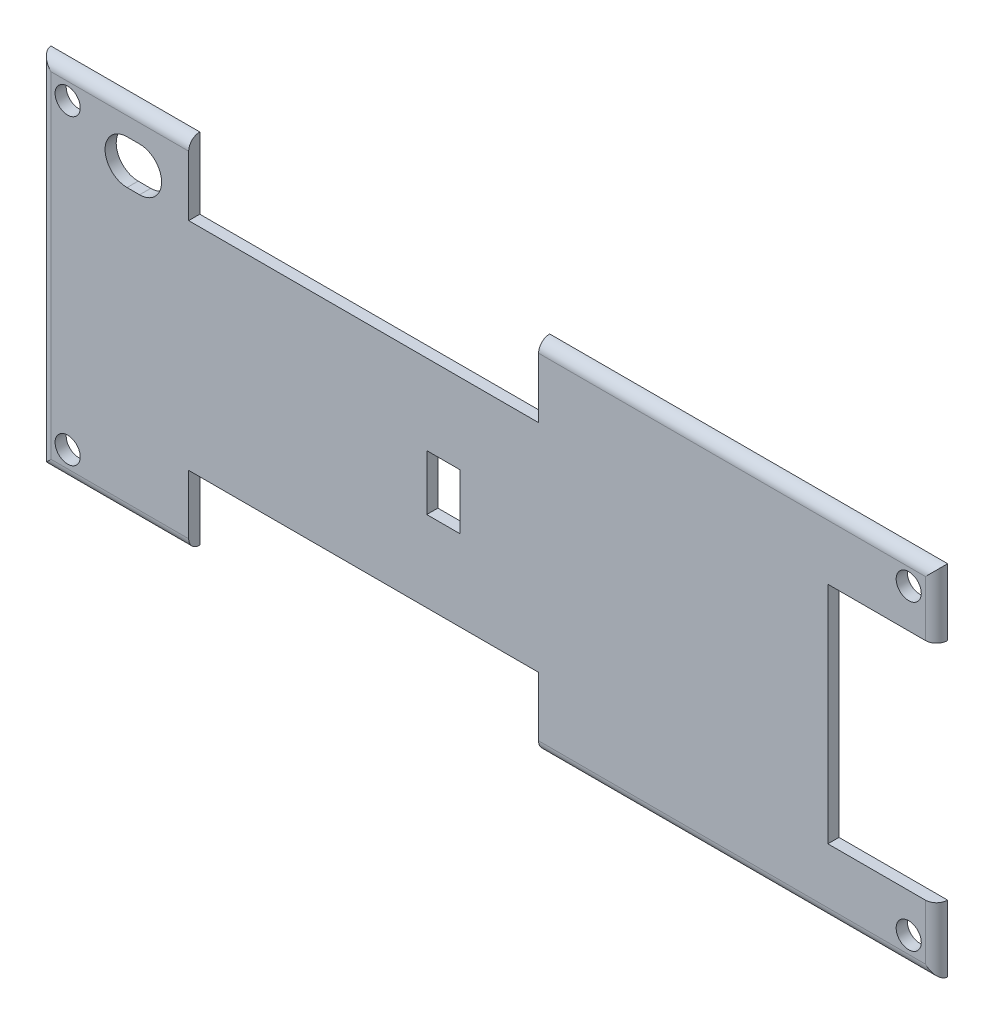
ISO-10303-21;
HEADER;
FILE_DESCRIPTION(('STEP AP214'),'2;1');
FILE_NAME('part.step','',(''),(''),'','','');
FILE_SCHEMA(('AUTOMOTIVE_DESIGN { 1 0 10303 214 1 1 1 1 }'));
ENDSEC;
DATA;
#1=APPLICATION_CONTEXT('core data for automotive mechanical design processes');
#2=APPLICATION_PROTOCOL_DEFINITION('international standard','automotive_design',2000,#1);
#3=PRODUCT_CONTEXT('',#1,'mechanical');
#4=PRODUCT('Part','Part','',(#3));
#5=PRODUCT_RELATED_PRODUCT_CATEGORY('part','',(#4));
#6=PRODUCT_DEFINITION_FORMATION('','',#4);
#7=PRODUCT_DEFINITION_CONTEXT('part definition',#1,'design');
#8=PRODUCT_DEFINITION('design','',#6,#7);
#9=PRODUCT_DEFINITION_SHAPE('','',#8);
#10=(LENGTH_UNIT() NAMED_UNIT(*) SI_UNIT(.MILLI.,.METRE.));
#11=(NAMED_UNIT(*) PLANE_ANGLE_UNIT() SI_UNIT($,.RADIAN.));
#12=(NAMED_UNIT(*) SI_UNIT($,.STERADIAN.) SOLID_ANGLE_UNIT());
#13=UNCERTAINTY_MEASURE_WITH_UNIT(LENGTH_MEASURE(1.E-05),#10,'distance_accuracy_value','');
#14=(GEOMETRIC_REPRESENTATION_CONTEXT(3) GLOBAL_UNCERTAINTY_ASSIGNED_CONTEXT((#13)) GLOBAL_UNIT_ASSIGNED_CONTEXT((#10,
#11,#12)) REPRESENTATION_CONTEXT('',''));
#15=CARTESIAN_POINT('',(0.,0.,0.));
#16=DIRECTION('',(0.,0.,1.));
#17=DIRECTION('',(1.,0.,0.));
#18=AXIS2_PLACEMENT_3D('',#15,#16,#17);
#19=CARTESIAN_POINT('',(0.,0.,1.));
#20=DIRECTION('',(0.,0.,1.));
#21=DIRECTION('',(1.,0.,0.));
#22=AXIS2_PLACEMENT_3D('',#19,#20,#21);
#23=PLANE('',#22);
#24=CARTESIAN_POINT('',(38.0906669286224,13.6,1.));
#25=DIRECTION('',(0.,0.,1.));
#26=DIRECTION('',(1.,0.,0.));
#27=AXIS2_PLACEMENT_3D('',#24,#25,#26);
#28=CIRCLE('',#27,1.1303);
#29=CARTESIAN_POINT('',(39.2209669286224,13.6,1.));
#30=VERTEX_POINT('',#29);
#31=EDGE_CURVE('E725',#30,#30,#28,.T.);
#32=ORIENTED_EDGE('',*,*,#31,.F.);
#33=EDGE_LOOP('',(#32));
#34=FACE_BOUND('',#33,.T.);
#35=CARTESIAN_POINT('',(-37.5321887929775,-13.58,1.));
#36=DIRECTION('',(0.,0.,1.));
#37=DIRECTION('',(1.,0.,0.));
#38=AXIS2_PLACEMENT_3D('',#35,#36,#37);
#39=CIRCLE('',#38,1.1303);
#40=CARTESIAN_POINT('',(-36.4018887929775,-13.58,1.));
#41=VERTEX_POINT('',#40);
#42=EDGE_CURVE('E233',#41,#41,#39,.T.);
#43=ORIENTED_EDGE('',*,*,#42,.F.);
#44=EDGE_LOOP('',(#43));
#45=FACE_BOUND('',#44,.T.);
#46=DIRECTION('',(1.,0.,0.));
#47=VECTOR('',#46,1.);
#48=CARTESIAN_POINT('',(30.8221984970327,10.1158248312757,1.));
#49=LINE('',#48,#47);
#50=CARTESIAN_POINT('',(30.8221984970327,10.1158248312757,1.));
#51=VERTEX_POINT('',#50);
#52=CARTESIAN_POINT('',(39.5906669286224,10.1158248312757,1.));
#53=VERTEX_POINT('',#52);
#54=EDGE_CURVE('E289',#51,#53,#49,.T.);
#55=ORIENTED_EDGE('',*,*,#54,.T.);
#56=DIRECTION('',(0.,1.,0.));
#57=VECTOR('',#56,1.);
#58=CARTESIAN_POINT('',(39.5906669286224,16.1,1.));
#59=LINE('',#58,#57);
#60=CARTESIAN_POINT('',(39.5906669286224,15.1,1.));
#61=VERTEX_POINT('',#60);
#62=EDGE_CURVE('E363',#53,#61,#59,.T.);
#63=ORIENTED_EDGE('',*,*,#62,.T.);
#64=DIRECTION('',(-1.,0.,0.));
#65=VECTOR('',#64,1.);
#66=CARTESIAN_POINT('',(4.81,15.1,1.));
#67=LINE('',#66,#65);
#68=CARTESIAN_POINT('',(4.81,15.1,1.));
#69=VERTEX_POINT('',#68);
#70=EDGE_CURVE('E361',#61,#69,#67,.T.);
#71=ORIENTED_EDGE('',*,*,#70,.T.);
#72=DIRECTION('',(0.,-1.,0.));
#73=VECTOR('',#72,1.);
#74=CARTESIAN_POINT('',(4.81,16.1,1.));
#75=LINE('',#74,#73);
#76=CARTESIAN_POINT('',(4.81,9.69393661700284,1.));
#77=VERTEX_POINT('',#76);
#78=EDGE_CURVE('E292',#69,#77,#75,.T.);
#79=ORIENTED_EDGE('',*,*,#78,.T.);
#80=DIRECTION('',(-1.,0.,0.));
#81=VECTOR('',#80,1.);
#82=CARTESIAN_POINT('',(4.81,9.69393661700284,1.));
#83=LINE('',#82,#81);
#84=CARTESIAN_POINT('',(-26.65,9.69393661700284,1.));
#85=VERTEX_POINT('',#84);
#86=EDGE_CURVE('E294',#77,#85,#83,.T.);
#87=ORIENTED_EDGE('',*,*,#86,.T.);
#88=DIRECTION('',(0.,1.,0.));
#89=VECTOR('',#88,1.);
#90=CARTESIAN_POINT('',(-26.65,9.69393661700284,1.));
#91=LINE('',#90,#89);
#92=CARTESIAN_POINT('',(-26.65,15.1,1.));
#93=VERTEX_POINT('',#92);
#94=EDGE_CURVE('E275',#85,#93,#91,.T.);
#95=ORIENTED_EDGE('',*,*,#94,.T.);
#96=DIRECTION('',(-1.,0.,0.));
#97=VECTOR('',#96,1.);
#98=CARTESIAN_POINT('',(-40.0321887929775,15.1,1.));
#99=LINE('',#98,#97);
#100=CARTESIAN_POINT('',(-39.0321887929775,15.1,1.));
#101=VERTEX_POINT('',#100);
#102=EDGE_CURVE('E351',#93,#101,#99,.T.);
#103=ORIENTED_EDGE('',*,*,#102,.T.);
#104=DIRECTION('',(0.,-1.,0.));
#105=VECTOR('',#104,1.);
#106=CARTESIAN_POINT('',(-39.0321887929775,-16.08,1.));
#107=LINE('',#106,#105);
#108=CARTESIAN_POINT('',(-39.0321887929775,-15.08,1.));
#109=VERTEX_POINT('',#108);
#110=EDGE_CURVE('E353',#101,#109,#107,.T.);
#111=ORIENTED_EDGE('',*,*,#110,.T.);
#112=DIRECTION('',(1.,0.,0.));
#113=VECTOR('',#112,1.);
#114=CARTESIAN_POINT('',(-26.65,-15.08,1.));
#115=LINE('',#114,#113);
#116=CARTESIAN_POINT('',(-26.65,-15.08,1.));
#117=VERTEX_POINT('',#116);
#118=EDGE_CURVE('E355',#109,#117,#115,.T.);
#119=ORIENTED_EDGE('',*,*,#118,.T.);
#120=DIRECTION('',(0.,1.,0.));
#121=VECTOR('',#120,1.);
#122=CARTESIAN_POINT('',(-26.65,-16.08,1.));
#123=LINE('',#122,#121);
#124=CARTESIAN_POINT('',(-26.65,-9.75218635475669,1.));
#125=VERTEX_POINT('',#124);
#126=EDGE_CURVE('E278',#117,#125,#123,.T.);
#127=ORIENTED_EDGE('',*,*,#126,.T.);
#128=DIRECTION('',(1.,0.,0.));
#129=VECTOR('',#128,1.);
#130=CARTESIAN_POINT('',(-26.65,-9.75218635475669,1.));
#131=LINE('',#130,#129);
#132=CARTESIAN_POINT('',(4.81,-9.75218635475669,1.));
#133=VERTEX_POINT('',#132);
#134=EDGE_CURVE('E281',#125,#133,#131,.T.);
#135=ORIENTED_EDGE('',*,*,#134,.T.);
#136=DIRECTION('',(0.,-1.,0.));
#137=VECTOR('',#136,1.);
#138=CARTESIAN_POINT('',(4.81,-9.75218635475669,1.));
#139=LINE('',#138,#137);
#140=CARTESIAN_POINT('',(4.81,-15.08,1.));
#141=VERTEX_POINT('',#140);
#142=EDGE_CURVE('E283',#133,#141,#139,.T.);
#143=ORIENTED_EDGE('',*,*,#142,.T.);
#144=DIRECTION('',(1.,0.,0.));
#145=VECTOR('',#144,1.);
#146=CARTESIAN_POINT('',(40.5906669286224,-15.08,1.));
#147=LINE('',#146,#145);
#148=CARTESIAN_POINT('',(39.5906669286224,-15.08,1.));
#149=VERTEX_POINT('',#148);
#150=EDGE_CURVE('E58',#141,#149,#147,.T.);
#151=ORIENTED_EDGE('',*,*,#150,.T.);
#152=DIRECTION('',(0.,1.,0.));
#153=VECTOR('',#152,1.);
#154=CARTESIAN_POINT('',(39.5906669286224,-10.0958248312755,1.));
#155=LINE('',#154,#153);
#156=CARTESIAN_POINT('',(39.5906669286224,-10.0958248312755,1.));
#157=VERTEX_POINT('',#156);
#158=EDGE_CURVE('E359',#149,#157,#155,.T.);
#159=ORIENTED_EDGE('',*,*,#158,.T.);
#160=DIRECTION('',(-1.,0.,0.));
#161=VECTOR('',#160,1.);
#162=CARTESIAN_POINT('',(40.5906669286224,-10.0958248312755,1.));
#163=LINE('',#162,#161);
#164=CARTESIAN_POINT('',(30.8221984970327,-10.0958248312755,1.));
#165=VERTEX_POINT('',#164);
#166=EDGE_CURVE('E285',#157,#165,#163,.T.);
#167=ORIENTED_EDGE('',*,*,#166,.T.);
#168=DIRECTION('',(0.,1.,0.));
#169=VECTOR('',#168,1.);
#170=CARTESIAN_POINT('',(30.8221984970327,-10.0958248312755,1.));
#171=LINE('',#170,#169);
#172=EDGE_CURVE('E287',#165,#51,#171,.T.);
#173=ORIENTED_EDGE('',*,*,#172,.T.);
#174=EDGE_LOOP('',(#55,#63,#71,#79,#87,#95,#103,#111,#119,#127,#135,#143,#151,#159,#167,#173));
#175=FACE_BOUND('',#174,.T.);
#176=DIRECTION('',(-1.,0.,0.));
#177=VECTOR('',#176,1.);
#178=CARTESIAN_POINT('',(-5.24392192876722,2.48999999999999,1.));
#179=LINE('',#178,#177);
#180=CARTESIAN_POINT('',(-2.26000000000001,2.48999999999999,1.));
#181=VERTEX_POINT('',#180);
#182=CARTESIAN_POINT('',(-5.24392192876722,2.48999999999999,1.));
#183=VERTEX_POINT('',#182);
#184=EDGE_CURVE('E246',#181,#183,#179,.T.);
#185=ORIENTED_EDGE('',*,*,#184,.F.);
#186=DIRECTION('',(0.,1.,0.));
#187=VECTOR('',#186,1.);
#188=CARTESIAN_POINT('',(-2.26000000000001,2.48999999999999,1.));
#189=LINE('',#188,#187);
#190=CARTESIAN_POINT('',(-2.26000000000001,-2.48999999999999,1.));
#191=VERTEX_POINT('',#190);
#192=EDGE_CURVE('E244',#191,#181,#189,.T.);
#193=ORIENTED_EDGE('',*,*,#192,.F.);
#194=DIRECTION('',(1.,0.,0.));
#195=VECTOR('',#194,1.);
#196=CARTESIAN_POINT('',(-5.24392192876722,-2.48999999999999,1.));
#197=LINE('',#196,#195);
#198=CARTESIAN_POINT('',(-5.24392192876722,-2.48999999999999,1.));
#199=VERTEX_POINT('',#198);
#200=EDGE_CURVE('E252',#199,#191,#197,.T.);
#201=ORIENTED_EDGE('',*,*,#200,.F.);
#202=DIRECTION('',(0.,-1.,0.));
#203=VECTOR('',#202,1.);
#204=CARTESIAN_POINT('',(-5.24392192876722,2.48999999999999,1.));
#205=LINE('',#204,#203);
#206=EDGE_CURVE('E249',#183,#199,#205,.T.);
#207=ORIENTED_EDGE('',*,*,#206,.F.);
#208=EDGE_LOOP('',(#185,#193,#201,#207));
#209=FACE_BOUND('',#208,.T.);
#210=DIRECTION('',(1.,0.,0.));
#211=VECTOR('',#210,1.);
#212=CARTESIAN_POINT('',(-32.1905916273917,9.50086591659359,1.));
#213=LINE('',#212,#211);
#214=CARTESIAN_POINT('',(-32.1905916273917,9.50086591659359,1.));
#215=VERTEX_POINT('',#214);
#216=CARTESIAN_POINT('',(-31.0617891364603,9.50086591659359,1.));
#217=VERTEX_POINT('',#216);
#218=EDGE_CURVE('E210',#215,#217,#213,.T.);
#219=ORIENTED_EDGE('',*,*,#218,.F.);
#220=CARTESIAN_POINT('',(-32.1905916273917,11.4763044446907,1.));
#221=DIRECTION('',(0.,0.,1.));
#222=DIRECTION('',(1.,0.,0.));
#223=AXIS2_PLACEMENT_3D('',#220,#221,#222);
#224=CIRCLE('',#223,1.97543852809706);
#225=CARTESIAN_POINT('',(-32.1905916273917,13.4517429727877,1.));
#226=VERTEX_POINT('',#225);
#227=EDGE_CURVE('E200',#226,#215,#224,.T.);
#228=ORIENTED_EDGE('',*,*,#227,.F.);
#229=DIRECTION('',(-1.,0.,0.));
#230=VECTOR('',#229,1.);
#231=CARTESIAN_POINT('',(-32.1905916273917,13.4517429727877,1.));
#232=LINE('',#231,#230);
#233=CARTESIAN_POINT('',(-31.0617891364603,13.4517429727877,1.));
#234=VERTEX_POINT('',#233);
#235=EDGE_CURVE('E226',#234,#226,#232,.T.);
#236=ORIENTED_EDGE('',*,*,#235,.F.);
#237=CARTESIAN_POINT('',(-31.0617891364603,11.4763044446907,1.));
#238=DIRECTION('',(0.,0.,1.));
#239=DIRECTION('',(1.,0.,0.));
#240=AXIS2_PLACEMENT_3D('',#237,#238,#239);
#241=CIRCLE('',#240,1.97543852809706);
#242=EDGE_CURVE('E224',#217,#234,#241,.T.);
#243=ORIENTED_EDGE('',*,*,#242,.F.);
#244=EDGE_LOOP('',(#219,#228,#236,#243));
#245=FACE_BOUND('',#244,.T.);
#246=CARTESIAN_POINT('',(-37.5321887929775,13.6,1.));
#247=DIRECTION('',(0.,0.,1.));
#248=DIRECTION('',(1.,0.,0.));
#249=AXIS2_PLACEMENT_3D('',#246,#247,#248);
#250=CIRCLE('',#249,1.1303);
#251=CARTESIAN_POINT('',(-36.4018887929775,13.6,1.));
#252=VERTEX_POINT('',#251);
#253=EDGE_CURVE('E731',#252,#252,#250,.T.);
#254=ORIENTED_EDGE('',*,*,#253,.F.);
#255=EDGE_LOOP('',(#254));
#256=FACE_BOUND('',#255,.T.);
#257=CARTESIAN_POINT('',(38.0906669286224,-13.58,1.));
#258=DIRECTION('',(0.,0.,1.));
#259=DIRECTION('',(1.,0.,0.));
#260=AXIS2_PLACEMENT_3D('',#257,#258,#259);
#261=CIRCLE('',#260,1.1303);
#262=CARTESIAN_POINT('',(39.2209669286224,-13.58,1.));
#263=VERTEX_POINT('',#262);
#264=EDGE_CURVE('E717',#263,#263,#261,.T.);
#265=ORIENTED_EDGE('',*,*,#264,.F.);
#266=EDGE_LOOP('',(#265));
#267=FACE_BOUND('',#266,.T.);
#268=ADVANCED_FACE('F33',(#34,#45,#175,#209,#245,#256,#267),#23,.T.);
#269=CARTESIAN_POINT('',(0.,0.,0.));
#270=DIRECTION('',(0.,0.,1.));
#271=DIRECTION('',(1.,0.,0.));
#272=AXIS2_PLACEMENT_3D('',#269,#270,#271);
#273=PLANE('',#272);
#274=DIRECTION('',(0.,1.,0.));
#275=VECTOR('',#274,1.);
#276=CARTESIAN_POINT('',(-2.26000000000001,2.48999999999999,0.));
#277=LINE('',#276,#275);
#278=CARTESIAN_POINT('',(-2.26000000000001,-2.48999999999999,0.));
#279=VERTEX_POINT('',#278);
#280=CARTESIAN_POINT('',(-2.26000000000001,2.48999999999999,0.));
#281=VERTEX_POINT('',#280);
#282=EDGE_CURVE('E218',#279,#281,#277,.T.);
#283=ORIENTED_EDGE('',*,*,#282,.T.);
#284=DIRECTION('',(-1.,0.,0.));
#285=VECTOR('',#284,1.);
#286=CARTESIAN_POINT('',(-5.24392192876722,2.48999999999999,0.));
#287=LINE('',#286,#285);
#288=CARTESIAN_POINT('',(-5.24392192876722,2.48999999999999,0.));
#289=VERTEX_POINT('',#288);
#290=EDGE_CURVE('E257',#281,#289,#287,.T.);
#291=ORIENTED_EDGE('',*,*,#290,.T.);
#292=DIRECTION('',(0.,-1.,0.));
#293=VECTOR('',#292,1.);
#294=CARTESIAN_POINT('',(-5.24392192876722,2.48999999999999,0.));
#295=LINE('',#294,#293);
#296=CARTESIAN_POINT('',(-5.24392192876722,-2.48999999999999,0.));
#297=VERTEX_POINT('',#296);
#298=EDGE_CURVE('E260',#289,#297,#295,.T.);
#299=ORIENTED_EDGE('',*,*,#298,.T.);
#300=DIRECTION('',(1.,0.,0.));
#301=VECTOR('',#300,1.);
#302=CARTESIAN_POINT('',(-5.24392192876722,-2.48999999999999,0.));
#303=LINE('',#302,#301);
#304=EDGE_CURVE('E247',#297,#279,#303,.T.);
#305=ORIENTED_EDGE('',*,*,#304,.T.);
#306=EDGE_LOOP('',(#283,#291,#299,#305));
#307=FACE_BOUND('',#306,.T.);
#308=DIRECTION('',(0.,1.,0.));
#309=VECTOR('',#308,1.);
#310=CARTESIAN_POINT('',(-26.65,9.69393661700284,0.));
#311=LINE('',#310,#309);
#312=CARTESIAN_POINT('',(-26.65,9.69393661700284,0.));
#313=VERTEX_POINT('',#312);
#314=CARTESIAN_POINT('',(-26.65,16.1,0.));
#315=VERTEX_POINT('',#314);
#316=EDGE_CURVE('E274',#313,#315,#311,.T.);
#317=ORIENTED_EDGE('',*,*,#316,.F.);
#318=DIRECTION('',(-1.,0.,0.));
#319=VECTOR('',#318,1.);
#320=CARTESIAN_POINT('',(4.81,9.69393661700284,0.));
#321=LINE('',#320,#319);
#322=CARTESIAN_POINT('',(4.81,9.69393661700284,0.));
#323=VERTEX_POINT('',#322);
#324=EDGE_CURVE('E279',#323,#313,#321,.T.);
#325=ORIENTED_EDGE('',*,*,#324,.F.);
#326=DIRECTION('',(0.,-1.,0.));
#327=VECTOR('',#326,1.);
#328=CARTESIAN_POINT('',(4.81,16.1,0.));
#329=LINE('',#328,#327);
#330=CARTESIAN_POINT('',(4.81,16.1,0.));
#331=VERTEX_POINT('',#330);
#332=EDGE_CURVE('E331',#331,#323,#329,.T.);
#333=ORIENTED_EDGE('',*,*,#332,.F.);
#334=DIRECTION('',(-1.,0.,0.));
#335=VECTOR('',#334,1.);
#336=CARTESIAN_POINT('',(40.5906669286224,16.1,0.));
#337=LINE('',#336,#335);
#338=CARTESIAN_POINT('',(40.5906669286224,16.1,0.));
#339=VERTEX_POINT('',#338);
#340=EDGE_CURVE('E328',#339,#331,#337,.T.);
#341=ORIENTED_EDGE('',*,*,#340,.F.);
#342=DIRECTION('',(0.,1.,0.));
#343=VECTOR('',#342,1.);
#344=CARTESIAN_POINT('',(40.5906669286224,10.1158248312757,0.));
#345=LINE('',#344,#343);
#346=CARTESIAN_POINT('',(40.5906669286224,10.1158248312757,0.));
#347=VERTEX_POINT('',#346);
#348=EDGE_CURVE('E326',#347,#339,#345,.T.);
#349=ORIENTED_EDGE('',*,*,#348,.F.);
#350=DIRECTION('',(1.,0.,0.));
#351=VECTOR('',#350,1.);
#352=CARTESIAN_POINT('',(30.8221984970327,10.1158248312757,0.));
#353=LINE('',#352,#351);
#354=CARTESIAN_POINT('',(30.8221984970327,10.1158248312757,0.));
#355=VERTEX_POINT('',#354);
#356=EDGE_CURVE('E324',#355,#347,#353,.T.);
#357=ORIENTED_EDGE('',*,*,#356,.F.);
#358=DIRECTION('',(0.,1.,0.));
#359=VECTOR('',#358,1.);
#360=CARTESIAN_POINT('',(30.8221984970327,-10.0958248312755,0.));
#361=LINE('',#360,#359);
#362=CARTESIAN_POINT('',(30.8221984970327,-10.0958248312755,0.));
#363=VERTEX_POINT('',#362);
#364=EDGE_CURVE('E322',#363,#355,#361,.T.);
#365=ORIENTED_EDGE('',*,*,#364,.F.);
#366=DIRECTION('',(-1.,0.,0.));
#367=VECTOR('',#366,1.);
#368=CARTESIAN_POINT('',(40.5906669286224,-10.0958248312755,0.));
#369=LINE('',#368,#367);
#370=CARTESIAN_POINT('',(40.5906669286224,-10.0958248312755,0.));
#371=VERTEX_POINT('',#370);
#372=EDGE_CURVE('E320',#371,#363,#369,.T.);
#373=ORIENTED_EDGE('',*,*,#372,.F.);
#374=DIRECTION('',(0.,1.,0.));
#375=VECTOR('',#374,1.);
#376=CARTESIAN_POINT('',(40.5906669286224,-16.08,0.));
#377=LINE('',#376,#375);
#378=CARTESIAN_POINT('',(40.5906669286224,-16.08,0.));
#379=VERTEX_POINT('',#378);
#380=EDGE_CURVE('E317',#379,#371,#377,.T.);
#381=ORIENTED_EDGE('',*,*,#380,.F.);
#382=DIRECTION('',(1.,0.,0.));
#383=VECTOR('',#382,1.);
#384=CARTESIAN_POINT('',(4.81,-16.08,0.));
#385=LINE('',#384,#383);
#386=CARTESIAN_POINT('',(4.81,-16.08,0.));
#387=VERTEX_POINT('',#386);
#388=EDGE_CURVE('E314',#387,#379,#385,.T.);
#389=ORIENTED_EDGE('',*,*,#388,.F.);
#390=DIRECTION('',(0.,-1.,0.));
#391=VECTOR('',#390,1.);
#392=CARTESIAN_POINT('',(4.81,-9.75218635475669,0.));
#393=LINE('',#392,#391);
#394=CARTESIAN_POINT('',(4.81,-9.75218635475669,0.));
#395=VERTEX_POINT('',#394);
#396=EDGE_CURVE('E312',#395,#387,#393,.T.);
#397=ORIENTED_EDGE('',*,*,#396,.F.);
#398=DIRECTION('',(1.,0.,0.));
#399=VECTOR('',#398,1.);
#400=CARTESIAN_POINT('',(-26.65,-9.75218635475669,0.));
#401=LINE('',#400,#399);
#402=CARTESIAN_POINT('',(-26.65,-9.75218635475669,0.));
#403=VERTEX_POINT('',#402);
#404=EDGE_CURVE('E310',#403,#395,#401,.T.);
#405=ORIENTED_EDGE('',*,*,#404,.F.);
#406=DIRECTION('',(0.,1.,0.));
#407=VECTOR('',#406,1.);
#408=CARTESIAN_POINT('',(-26.65,-16.08,0.));
#409=LINE('',#408,#407);
#410=CARTESIAN_POINT('',(-26.65,-16.08,0.));
#411=VERTEX_POINT('',#410);
#412=EDGE_CURVE('E308',#411,#403,#409,.T.);
#413=ORIENTED_EDGE('',*,*,#412,.F.);
#414=DIRECTION('',(1.,0.,0.));
#415=VECTOR('',#414,1.);
#416=CARTESIAN_POINT('',(-40.0321887929775,-16.08,0.));
#417=LINE('',#416,#415);
#418=CARTESIAN_POINT('',(-40.0321887929775,-16.08,0.));
#419=VERTEX_POINT('',#418);
#420=EDGE_CURVE('E305',#419,#411,#417,.T.);
#421=ORIENTED_EDGE('',*,*,#420,.F.);
#422=DIRECTION('',(0.,-1.,0.));
#423=VECTOR('',#422,1.);
#424=CARTESIAN_POINT('',(-40.0321887929775,16.1,0.));
#425=LINE('',#424,#423);
#426=CARTESIAN_POINT('',(-40.0321887929775,16.1,0.));
#427=VERTEX_POINT('',#426);
#428=EDGE_CURVE('E302',#427,#419,#425,.T.);
#429=ORIENTED_EDGE('',*,*,#428,.F.);
#430=DIRECTION('',(-1.,0.,0.));
#431=VECTOR('',#430,1.);
#432=CARTESIAN_POINT('',(-26.65,16.1,0.));
#433=LINE('',#432,#431);
#434=EDGE_CURVE('E299',#315,#427,#433,.T.);
#435=ORIENTED_EDGE('',*,*,#434,.F.);
#436=EDGE_LOOP('',(#317,#325,#333,#341,#349,#357,#365,#373,#381,#389,#397,#405,#413,#421,#429,#435));
#437=FACE_BOUND('',#436,.T.);
#438=CARTESIAN_POINT('',(-32.1905916273917,11.4763044446907,0.));
#439=DIRECTION('',(0.,0.,1.));
#440=DIRECTION('',(1.,0.,0.));
#441=AXIS2_PLACEMENT_3D('',#438,#439,#440);
#442=CIRCLE('',#441,1.97543852809706);
#443=CARTESIAN_POINT('',(-32.1905916273917,13.4517429727877,0.));
#444=VERTEX_POINT('',#443);
#445=CARTESIAN_POINT('',(-32.1905916273917,9.50086591659359,0.));
#446=VERTEX_POINT('',#445);
#447=EDGE_CURVE('E231',#444,#446,#442,.T.);
#448=ORIENTED_EDGE('',*,*,#447,.T.);
#449=DIRECTION('',(1.,0.,0.));
#450=VECTOR('',#449,1.);
#451=CARTESIAN_POINT('',(-32.1905916273917,9.50086591659359,0.));
#452=LINE('',#451,#450);
#453=CARTESIAN_POINT('',(-31.0617891364603,9.50086591659359,0.));
#454=VERTEX_POINT('',#453);
#455=EDGE_CURVE('E217',#446,#454,#452,.T.);
#456=ORIENTED_EDGE('',*,*,#455,.T.);
#457=CARTESIAN_POINT('',(-31.0617891364603,11.4763044446907,0.));
#458=DIRECTION('',(0.,0.,1.));
#459=DIRECTION('',(1.,0.,0.));
#460=AXIS2_PLACEMENT_3D('',#457,#458,#459);
#461=CIRCLE('',#460,1.97543852809706);
#462=CARTESIAN_POINT('',(-31.0617891364603,13.4517429727877,0.));
#463=VERTEX_POINT('',#462);
#464=EDGE_CURVE('E235',#454,#463,#461,.T.);
#465=ORIENTED_EDGE('',*,*,#464,.T.);
#466=DIRECTION('',(-1.,0.,0.));
#467=VECTOR('',#466,1.);
#468=CARTESIAN_POINT('',(-32.1905916273917,13.4517429727877,0.));
#469=LINE('',#468,#467);
#470=EDGE_CURVE('E211',#463,#444,#469,.T.);
#471=ORIENTED_EDGE('',*,*,#470,.T.);
#472=EDGE_LOOP('',(#448,#456,#465,#471));
#473=FACE_BOUND('',#472,.T.);
#474=CARTESIAN_POINT('',(-37.5321887929775,-13.58,0.));
#475=DIRECTION('',(0.,0.,1.));
#476=DIRECTION('',(1.,0.,0.));
#477=AXIS2_PLACEMENT_3D('',#474,#475,#476);
#478=CIRCLE('',#477,1.1303);
#479=CARTESIAN_POINT('',(-36.4018887929775,-13.58,0.));
#480=VERTEX_POINT('',#479);
#481=EDGE_CURVE('E734',#480,#480,#478,.T.);
#482=ORIENTED_EDGE('',*,*,#481,.T.);
#483=EDGE_LOOP('',(#482));
#484=FACE_BOUND('',#483,.T.);
#485=CARTESIAN_POINT('',(-37.5321887929775,13.6,0.));
#486=DIRECTION('',(0.,0.,1.));
#487=DIRECTION('',(1.,0.,0.));
#488=AXIS2_PLACEMENT_3D('',#485,#486,#487);
#489=CIRCLE('',#488,1.1303);
#490=CARTESIAN_POINT('',(-36.4018887929775,13.6,0.));
#491=VERTEX_POINT('',#490);
#492=EDGE_CURVE('E728',#491,#491,#489,.T.);
#493=ORIENTED_EDGE('',*,*,#492,.T.);
#494=EDGE_LOOP('',(#493));
#495=FACE_BOUND('',#494,.T.);
#496=CARTESIAN_POINT('',(38.0906669286224,13.6,0.));
#497=DIRECTION('',(0.,0.,1.));
#498=DIRECTION('',(1.,0.,0.));
#499=AXIS2_PLACEMENT_3D('',#496,#497,#498);
#500=CIRCLE('',#499,1.1303);
#501=CARTESIAN_POINT('',(39.2209669286224,13.6,0.));
#502=VERTEX_POINT('',#501);
#503=EDGE_CURVE('E722',#502,#502,#500,.T.);
#504=ORIENTED_EDGE('',*,*,#503,.T.);
#505=EDGE_LOOP('',(#504));
#506=FACE_BOUND('',#505,.T.);
#507=CARTESIAN_POINT('',(38.0906669286224,-13.58,0.));
#508=DIRECTION('',(0.,0.,1.));
#509=DIRECTION('',(1.,0.,0.));
#510=AXIS2_PLACEMENT_3D('',#507,#508,#509);
#511=CIRCLE('',#510,1.1303);
#512=CARTESIAN_POINT('',(39.2209669286224,-13.58,0.));
#513=VERTEX_POINT('',#512);
#514=EDGE_CURVE('E376',#513,#513,#511,.T.);
#515=ORIENTED_EDGE('',*,*,#514,.T.);
#516=EDGE_LOOP('',(#515));
#517=FACE_BOUND('',#516,.T.);
#518=ADVANCED_FACE('F394',(#307,#437,#473,#484,#495,#506,#517),#273,.F.);
#519=CARTESIAN_POINT('',(-26.65,9.69393661700284,1.));
#520=DIRECTION('',(-1.,0.,0.));
#521=DIRECTION('',(0.,-1.,0.));
#522=AXIS2_PLACEMENT_3D('',#519,#520,#521);
#523=PLANE('',#522);
#524=ORIENTED_EDGE('',*,*,#316,.T.);
#525=CARTESIAN_POINT('',(-26.65,15.1,0.));
#526=DIRECTION('',(-1.,0.,0.));
#527=DIRECTION('',(0.,-1.,0.));
#528=AXIS2_PLACEMENT_3D('',#525,#526,#527);
#529=CIRCLE('',#528,1.);
#530=EDGE_CURVE('E11',#315,#93,#529,.F.);
#531=ORIENTED_EDGE('',*,*,#530,.T.);
#532=ORIENTED_EDGE('',*,*,#94,.F.);
#533=DIRECTION('',(0.,0.,-1.));
#534=VECTOR('',#533,1.);
#535=CARTESIAN_POINT('',(-26.65,9.69393661700284,1.));
#536=LINE('',#535,#534);
#537=EDGE_CURVE('E296',#85,#313,#536,.T.);
#538=ORIENTED_EDGE('',*,*,#537,.T.);
#539=EDGE_LOOP('',(#524,#531,#532,#538));
#540=FACE_BOUND('',#539,.T.);
#541=ADVANCED_FACE('F398',(#540),#523,.F.);
#542=CARTESIAN_POINT('',(-26.65,-16.08,1.));
#543=DIRECTION('',(-1.,0.,0.));
#544=DIRECTION('',(0.,0.,1.));
#545=AXIS2_PLACEMENT_3D('',#542,#543,#544);
#546=PLANE('',#545);
#547=ORIENTED_EDGE('',*,*,#126,.F.);
#548=CARTESIAN_POINT('',(-26.65,-15.08,0.));
#549=DIRECTION('',(-1.,0.,0.));
#550=DIRECTION('',(0.,0.,1.));
#551=AXIS2_PLACEMENT_3D('',#548,#549,#550);
#552=CIRCLE('',#551,1.);
#553=EDGE_CURVE('E42',#117,#411,#552,.F.);
#554=ORIENTED_EDGE('',*,*,#553,.T.);
#555=ORIENTED_EDGE('',*,*,#412,.T.);
#556=DIRECTION('',(0.,0.,-1.));
#557=VECTOR('',#556,1.);
#558=CARTESIAN_POINT('',(-26.65,-9.75218635475669,1.));
#559=LINE('',#558,#557);
#560=EDGE_CURVE('E348',#125,#403,#559,.T.);
#561=ORIENTED_EDGE('',*,*,#560,.F.);
#562=EDGE_LOOP('',(#547,#554,#555,#561));
#563=FACE_BOUND('',#562,.T.);
#564=ADVANCED_FACE('F450',(#563),#546,.F.);
#565=CARTESIAN_POINT('',(-26.65,-9.75218635475669,1.));
#566=DIRECTION('',(0.,1.,0.));
#567=DIRECTION('',(0.,0.,1.));
#568=AXIS2_PLACEMENT_3D('',#565,#566,#567);
#569=PLANE('',#568);
#570=ORIENTED_EDGE('',*,*,#404,.T.);
#571=DIRECTION('',(0.,0.,-1.));
#572=VECTOR('',#571,1.);
#573=CARTESIAN_POINT('',(4.81,-9.75218635475669,1.));
#574=LINE('',#573,#572);
#575=EDGE_CURVE('E345',#133,#395,#574,.T.);
#576=ORIENTED_EDGE('',*,*,#575,.F.);
#577=ORIENTED_EDGE('',*,*,#134,.F.);
#578=ORIENTED_EDGE('',*,*,#560,.T.);
#579=EDGE_LOOP('',(#570,#576,#577,#578));
#580=FACE_BOUND('',#579,.T.);
#581=ADVANCED_FACE('F445',(#580),#569,.F.);
#582=CARTESIAN_POINT('',(4.81,-9.75218635475669,1.));
#583=DIRECTION('',(1.,0.,0.));
#584=DIRECTION('',(0.,1.,0.));
#585=AXIS2_PLACEMENT_3D('',#582,#583,#584);
#586=PLANE('',#585);
#587=ORIENTED_EDGE('',*,*,#396,.T.);
#588=CARTESIAN_POINT('',(4.81,-15.08,0.));
#589=DIRECTION('',(1.,0.,0.));
#590=DIRECTION('',(0.,1.,0.));
#591=AXIS2_PLACEMENT_3D('',#588,#589,#590);
#592=CIRCLE('',#591,1.);
#593=EDGE_CURVE('E372',#387,#141,#592,.F.);
#594=ORIENTED_EDGE('',*,*,#593,.T.);
#595=ORIENTED_EDGE('',*,*,#142,.F.);
#596=ORIENTED_EDGE('',*,*,#575,.T.);
#597=EDGE_LOOP('',(#587,#594,#595,#596));
#598=FACE_BOUND('',#597,.T.);
#599=ADVANCED_FACE('F439',(#598),#586,.F.);
#600=CARTESIAN_POINT('',(40.5906669286224,-10.0958248312755,1.));
#601=DIRECTION('',(0.,-1.,0.));
#602=DIRECTION('',(0.,0.,-1.));
#603=AXIS2_PLACEMENT_3D('',#600,#601,#602);
#604=PLANE('',#603);
#605=ORIENTED_EDGE('',*,*,#166,.F.);
#606=CARTESIAN_POINT('',(39.5906669286224,-10.0958248312755,0.));
#607=DIRECTION('',(0.,-1.,0.));
#608=DIRECTION('',(0.,0.,-1.));
#609=AXIS2_PLACEMENT_3D('',#606,#607,#608);
#610=CIRCLE('',#609,1.);
#611=EDGE_CURVE('E370',#157,#371,#610,.F.);
#612=ORIENTED_EDGE('',*,*,#611,.T.);
#613=ORIENTED_EDGE('',*,*,#372,.T.);
#614=DIRECTION('',(0.,0.,-1.));
#615=VECTOR('',#614,1.);
#616=CARTESIAN_POINT('',(30.8221984970327,-10.0958248312755,1.));
#617=LINE('',#616,#615);
#618=EDGE_CURVE('E342',#165,#363,#617,.T.);
#619=ORIENTED_EDGE('',*,*,#618,.F.);
#620=EDGE_LOOP('',(#605,#612,#613,#619));
#621=FACE_BOUND('',#620,.T.);
#622=ADVANCED_FACE('F428',(#621),#604,.F.);
#623=CARTESIAN_POINT('',(30.8221984970327,-10.0958248312755,1.));
#624=DIRECTION('',(-1.,0.,0.));
#625=DIRECTION('',(0.,0.,1.));
#626=AXIS2_PLACEMENT_3D('',#623,#624,#625);
#627=PLANE('',#626);
#628=ORIENTED_EDGE('',*,*,#364,.T.);
#629=DIRECTION('',(0.,0.,-1.));
#630=VECTOR('',#629,1.);
#631=CARTESIAN_POINT('',(30.8221984970327,10.1158248312757,1.));
#632=LINE('',#631,#630);
#633=EDGE_CURVE('E339',#51,#355,#632,.T.);
#634=ORIENTED_EDGE('',*,*,#633,.F.);
#635=ORIENTED_EDGE('',*,*,#172,.F.);
#636=ORIENTED_EDGE('',*,*,#618,.T.);
#637=EDGE_LOOP('',(#628,#634,#635,#636));
#638=FACE_BOUND('',#637,.T.);
#639=ADVANCED_FACE('F423',(#638),#627,.F.);
#640=CARTESIAN_POINT('',(30.8221984970327,10.1158248312757,1.));
#641=DIRECTION('',(0.,1.,0.));
#642=DIRECTION('',(0.,0.,1.));
#643=AXIS2_PLACEMENT_3D('',#640,#641,#642);
#644=PLANE('',#643);
#645=ORIENTED_EDGE('',*,*,#356,.T.);
#646=CARTESIAN_POINT('',(39.5906669286224,10.1158248312757,0.));
#647=DIRECTION('',(0.,1.,0.));
#648=DIRECTION('',(0.,0.,1.));
#649=AXIS2_PLACEMENT_3D('',#646,#647,#648);
#650=CIRCLE('',#649,1.);
#651=EDGE_CURVE('E366',#347,#53,#650,.F.);
#652=ORIENTED_EDGE('',*,*,#651,.T.);
#653=ORIENTED_EDGE('',*,*,#54,.F.);
#654=ORIENTED_EDGE('',*,*,#633,.T.);
#655=EDGE_LOOP('',(#645,#652,#653,#654));
#656=FACE_BOUND('',#655,.T.);
#657=ADVANCED_FACE('F417',(#656),#644,.F.);
#658=CARTESIAN_POINT('',(4.81,16.1,1.));
#659=DIRECTION('',(1.,0.,0.));
#660=DIRECTION('',(0.,0.,-1.));
#661=AXIS2_PLACEMENT_3D('',#658,#659,#660);
#662=PLANE('',#661);
#663=ORIENTED_EDGE('',*,*,#78,.F.);
#664=CARTESIAN_POINT('',(4.81,15.1,0.));
#665=DIRECTION('',(1.,0.,0.));
#666=DIRECTION('',(0.,0.,-1.));
#667=AXIS2_PLACEMENT_3D('',#664,#665,#666);
#668=CIRCLE('',#667,1.);
#669=EDGE_CURVE('E368',#69,#331,#668,.F.);
#670=ORIENTED_EDGE('',*,*,#669,.T.);
#671=ORIENTED_EDGE('',*,*,#332,.T.);
#672=DIRECTION('',(0.,0.,-1.));
#673=VECTOR('',#672,1.);
#674=CARTESIAN_POINT('',(4.81,9.69393661700284,1.));
#675=LINE('',#674,#673);
#676=EDGE_CURVE('E336',#77,#323,#675,.T.);
#677=ORIENTED_EDGE('',*,*,#676,.F.);
#678=EDGE_LOOP('',(#663,#670,#671,#677));
#679=FACE_BOUND('',#678,.T.);
#680=ADVANCED_FACE('F475',(#679),#662,.F.);
#681=CARTESIAN_POINT('',(4.81,9.69393661700284,1.));
#682=DIRECTION('',(0.,-1.,0.));
#683=DIRECTION('',(1.,0.,0.));
#684=AXIS2_PLACEMENT_3D('',#681,#682,#683);
#685=PLANE('',#684);
#686=ORIENTED_EDGE('',*,*,#324,.T.);
#687=ORIENTED_EDGE('',*,*,#537,.F.);
#688=ORIENTED_EDGE('',*,*,#86,.F.);
#689=ORIENTED_EDGE('',*,*,#676,.T.);
#690=EDGE_LOOP('',(#686,#687,#688,#689));
#691=FACE_BOUND('',#690,.T.);
#692=ADVANCED_FACE('F403',(#691),#685,.F.);
#693=CARTESIAN_POINT('',(-2.26000000000001,2.48999999999999,1.));
#694=DIRECTION('',(-1.,0.,0.));
#695=DIRECTION('',(0.,0.,1.));
#696=AXIS2_PLACEMENT_3D('',#693,#694,#695);
#697=PLANE('',#696);
#698=ORIENTED_EDGE('',*,*,#282,.F.);
#699=DIRECTION('',(0.,0.,-1.));
#700=VECTOR('',#699,1.);
#701=CARTESIAN_POINT('',(-2.26000000000001,-2.48999999999999,1.));
#702=LINE('',#701,#700);
#703=EDGE_CURVE('E254',#191,#279,#702,.T.);
#704=ORIENTED_EDGE('',*,*,#703,.F.);
#705=ORIENTED_EDGE('',*,*,#192,.T.);
#706=DIRECTION('',(0.,0.,-1.));
#707=VECTOR('',#706,1.);
#708=CARTESIAN_POINT('',(-2.26000000000001,2.48999999999999,1.));
#709=LINE('',#708,#707);
#710=EDGE_CURVE('E271',#181,#281,#709,.T.);
#711=ORIENTED_EDGE('',*,*,#710,.T.);
#712=EDGE_LOOP('',(#698,#704,#705,#711));
#713=FACE_BOUND('',#712,.T.);
#714=ADVANCED_FACE('F470',(#713),#697,.T.);
#715=CARTESIAN_POINT('',(-5.24392192876722,2.48999999999999,1.));
#716=DIRECTION('',(0.,-1.,0.));
#717=DIRECTION('',(0.,0.,-1.));
#718=AXIS2_PLACEMENT_3D('',#715,#716,#717);
#719=PLANE('',#718);
#720=ORIENTED_EDGE('',*,*,#290,.F.);
#721=ORIENTED_EDGE('',*,*,#710,.F.);
#722=ORIENTED_EDGE('',*,*,#184,.T.);
#723=DIRECTION('',(0.,0.,-1.));
#724=VECTOR('',#723,1.);
#725=CARTESIAN_POINT('',(-5.24392192876722,2.48999999999999,1.));
#726=LINE('',#725,#724);
#727=EDGE_CURVE('E269',#183,#289,#726,.T.);
#728=ORIENTED_EDGE('',*,*,#727,.T.);
#729=EDGE_LOOP('',(#720,#721,#722,#728));
#730=FACE_BOUND('',#729,.T.);
#731=ADVANCED_FACE('F516',(#730),#719,.T.);
#732=CARTESIAN_POINT('',(-5.24392192876722,2.48999999999999,1.));
#733=DIRECTION('',(1.,0.,0.));
#734=DIRECTION('',(0.,1.,0.));
#735=AXIS2_PLACEMENT_3D('',#732,#733,#734);
#736=PLANE('',#735);
#737=ORIENTED_EDGE('',*,*,#298,.F.);
#738=ORIENTED_EDGE('',*,*,#727,.F.);
#739=ORIENTED_EDGE('',*,*,#206,.T.);
#740=DIRECTION('',(0.,0.,-1.));
#741=VECTOR('',#740,1.);
#742=CARTESIAN_POINT('',(-5.24392192876722,-2.48999999999999,1.));
#743=LINE('',#742,#741);
#744=EDGE_CURVE('E267',#199,#297,#743,.T.);
#745=ORIENTED_EDGE('',*,*,#744,.T.);
#746=EDGE_LOOP('',(#737,#738,#739,#745));
#747=FACE_BOUND('',#746,.T.);
#748=ADVANCED_FACE('F523',(#747),#736,.T.);
#749=CARTESIAN_POINT('',(-5.24392192876722,-2.48999999999999,1.));
#750=DIRECTION('',(0.,1.,0.));
#751=DIRECTION('',(0.,0.,1.));
#752=AXIS2_PLACEMENT_3D('',#749,#750,#751);
#753=PLANE('',#752);
#754=ORIENTED_EDGE('',*,*,#304,.F.);
#755=ORIENTED_EDGE('',*,*,#744,.F.);
#756=ORIENTED_EDGE('',*,*,#200,.T.);
#757=ORIENTED_EDGE('',*,*,#703,.T.);
#758=EDGE_LOOP('',(#754,#755,#756,#757));
#759=FACE_BOUND('',#758,.T.);
#760=ADVANCED_FACE('F530',(#759),#753,.T.);
#761=CARTESIAN_POINT('',(-32.1905916273917,11.4763044446907,1.));
#762=DIRECTION('',(0.,0.,-1.));
#763=DIRECTION('',(-1.,0.,0.));
#764=AXIS2_PLACEMENT_3D('',#761,#762,#763);
#765=CYLINDRICAL_SURFACE('',#764,1.97543852809706);
#766=ORIENTED_EDGE('',*,*,#447,.F.);
#767=DIRECTION('',(0.,0.,-1.));
#768=VECTOR('',#767,1.);
#769=CARTESIAN_POINT('',(-32.1905916273917,13.4517429727877,1.));
#770=LINE('',#769,#768);
#771=EDGE_CURVE('E206',#226,#444,#770,.T.);
#772=ORIENTED_EDGE('',*,*,#771,.F.);
#773=ORIENTED_EDGE('',*,*,#227,.T.);
#774=DIRECTION('',(0.,0.,-1.));
#775=VECTOR('',#774,1.);
#776=CARTESIAN_POINT('',(-32.1905916273917,9.50086591659359,1.));
#777=LINE('',#776,#775);
#778=EDGE_CURVE('E203',#215,#446,#777,.T.);
#779=ORIENTED_EDGE('',*,*,#778,.T.);
#780=EDGE_LOOP('',(#766,#772,#773,#779));
#781=FACE_BOUND('',#780,.T.);
#782=ADVANCED_FACE('F202',(#781),#765,.F.);
#783=CARTESIAN_POINT('',(-32.1905916273917,9.50086591659359,1.));
#784=DIRECTION('',(0.,1.,0.));
#785=DIRECTION('',(0.,0.,1.));
#786=AXIS2_PLACEMENT_3D('',#783,#784,#785);
#787=PLANE('',#786);
#788=ORIENTED_EDGE('',*,*,#455,.F.);
#789=ORIENTED_EDGE('',*,*,#778,.F.);
#790=ORIENTED_EDGE('',*,*,#218,.T.);
#791=DIRECTION('',(0.,0.,-1.));
#792=VECTOR('',#791,1.);
#793=CARTESIAN_POINT('',(-31.0617891364603,9.50086591659359,1.));
#794=LINE('',#793,#792);
#795=EDGE_CURVE('E219',#217,#454,#794,.T.);
#796=ORIENTED_EDGE('',*,*,#795,.T.);
#797=EDGE_LOOP('',(#788,#789,#790,#796));
#798=FACE_BOUND('',#797,.T.);
#799=ADVANCED_FACE('F214',(#798),#787,.T.);
#800=CARTESIAN_POINT('',(-31.0617891364603,11.4763044446907,1.));
#801=DIRECTION('',(0.,0.,-1.));
#802=DIRECTION('',(-1.,0.,0.));
#803=AXIS2_PLACEMENT_3D('',#800,#801,#802);
#804=CYLINDRICAL_SURFACE('',#803,1.97543852809706);
#805=ORIENTED_EDGE('',*,*,#464,.F.);
#806=ORIENTED_EDGE('',*,*,#795,.F.);
#807=ORIENTED_EDGE('',*,*,#242,.T.);
#808=DIRECTION('',(0.,0.,-1.));
#809=VECTOR('',#808,1.);
#810=CARTESIAN_POINT('',(-31.0617891364603,13.4517429727877,1.));
#811=LINE('',#810,#809);
#812=EDGE_CURVE('E241',#234,#463,#811,.T.);
#813=ORIENTED_EDGE('',*,*,#812,.T.);
#814=EDGE_LOOP('',(#805,#806,#807,#813));
#815=FACE_BOUND('',#814,.T.);
#816=ADVANCED_FACE('F551',(#815),#804,.F.);
#817=CARTESIAN_POINT('',(-32.1905916273917,13.4517429727877,1.));
#818=DIRECTION('',(0.,-1.,0.));
#819=DIRECTION('',(0.,0.,-1.));
#820=AXIS2_PLACEMENT_3D('',#817,#818,#819);
#821=PLANE('',#820);
#822=ORIENTED_EDGE('',*,*,#470,.F.);
#823=ORIENTED_EDGE('',*,*,#812,.F.);
#824=ORIENTED_EDGE('',*,*,#235,.T.);
#825=ORIENTED_EDGE('',*,*,#771,.T.);
#826=EDGE_LOOP('',(#822,#823,#824,#825));
#827=FACE_BOUND('',#826,.T.);
#828=ADVANCED_FACE('F558',(#827),#821,.T.);
#829=CARTESIAN_POINT('',(-37.5321887929775,-13.58,1.));
#830=DIRECTION('',(0.,0.,-1.));
#831=DIRECTION('',(-1.,0.,0.));
#832=AXIS2_PLACEMENT_3D('',#829,#830,#831);
#833=CYLINDRICAL_SURFACE('',#832,1.1303);
#834=ORIENTED_EDGE('',*,*,#42,.T.);
#835=EDGE_LOOP('',(#834));
#836=FACE_BOUND('',#835,.T.);
#837=ORIENTED_EDGE('',*,*,#481,.F.);
#838=EDGE_LOOP('',(#837));
#839=FACE_BOUND('',#838,.T.);
#840=ADVANCED_FACE('F566',(#836,#839),#833,.F.);
#841=CARTESIAN_POINT('',(-37.5321887929775,13.6,1.));
#842=DIRECTION('',(0.,0.,-1.));
#843=DIRECTION('',(-1.,0.,0.));
#844=AXIS2_PLACEMENT_3D('',#841,#842,#843);
#845=CYLINDRICAL_SURFACE('',#844,1.1303);
#846=ORIENTED_EDGE('',*,*,#253,.T.);
#847=EDGE_LOOP('',(#846));
#848=FACE_BOUND('',#847,.T.);
#849=ORIENTED_EDGE('',*,*,#492,.F.);
#850=EDGE_LOOP('',(#849));
#851=FACE_BOUND('',#850,.T.);
#852=ADVANCED_FACE('F574',(#848,#851),#845,.F.);
#853=CARTESIAN_POINT('',(38.0906669286224,13.6,1.));
#854=DIRECTION('',(0.,0.,-1.));
#855=DIRECTION('',(-1.,0.,0.));
#856=AXIS2_PLACEMENT_3D('',#853,#854,#855);
#857=CYLINDRICAL_SURFACE('',#856,1.1303);
#858=ORIENTED_EDGE('',*,*,#31,.T.);
#859=EDGE_LOOP('',(#858));
#860=FACE_BOUND('',#859,.T.);
#861=ORIENTED_EDGE('',*,*,#503,.F.);
#862=EDGE_LOOP('',(#861));
#863=FACE_BOUND('',#862,.T.);
#864=ADVANCED_FACE('F582',(#860,#863),#857,.F.);
#865=CARTESIAN_POINT('',(38.0906669286224,-13.58,1.));
#866=DIRECTION('',(0.,0.,-1.));
#867=DIRECTION('',(-1.,0.,0.));
#868=AXIS2_PLACEMENT_3D('',#865,#866,#867);
#869=CYLINDRICAL_SURFACE('',#868,1.1303);
#870=ORIENTED_EDGE('',*,*,#264,.T.);
#871=EDGE_LOOP('',(#870));
#872=FACE_BOUND('',#871,.T.);
#873=ORIENTED_EDGE('',*,*,#514,.F.);
#874=EDGE_LOOP('',(#873));
#875=FACE_BOUND('',#874,.T.);
#876=ADVANCED_FACE('F590',(#872,#875),#869,.F.);
#877=CARTESIAN_POINT('',(0.,15.1,0.));
#878=DIRECTION('',(1.,0.,0.));
#879=DIRECTION('',(0.,0.,-1.));
#880=AXIS2_PLACEMENT_3D('',#877,#878,#879);
#881=CYLINDRICAL_SURFACE('',#880,1.);
#882=ORIENTED_EDGE('',*,*,#669,.F.);
#883=ORIENTED_EDGE('',*,*,#70,.F.);
#884=CARTESIAN_POINT('',(39.5906669286224,15.1,0.));
#885=DIRECTION('',(0.707106781186547,-0.707106781186547,0.));
#886=DIRECTION('',(0.707106781186547,0.707106781186547,0.));
#887=AXIS2_PLACEMENT_3D('',#884,#885,#886);
#888=ELLIPSE('',#887,1.41421356237309,1.);
#889=EDGE_CURVE('E50',#339,#61,#888,.T.);
#890=ORIENTED_EDGE('',*,*,#889,.F.);
#891=ORIENTED_EDGE('',*,*,#340,.T.);
#892=EDGE_LOOP('',(#882,#883,#890,#891));
#893=FACE_BOUND('',#892,.T.);
#894=ADVANCED_FACE('F410',(#893),#881,.T.);
#895=CARTESIAN_POINT('',(39.5906669286224,0.,0.));
#896=DIRECTION('',(0.,-1.,0.));
#897=DIRECTION('',(0.,0.,-1.));
#898=AXIS2_PLACEMENT_3D('',#895,#896,#897);
#899=CYLINDRICAL_SURFACE('',#898,1.);
#900=ORIENTED_EDGE('',*,*,#651,.F.);
#901=ORIENTED_EDGE('',*,*,#348,.T.);
#902=ORIENTED_EDGE('',*,*,#889,.T.);
#903=ORIENTED_EDGE('',*,*,#62,.F.);
#904=EDGE_LOOP('',(#900,#901,#902,#903));
#905=FACE_BOUND('',#904,.T.);
#906=ADVANCED_FACE('F415',(#905),#899,.T.);
#907=CARTESIAN_POINT('',(0.,-15.08,0.));
#908=DIRECTION('',(-1.,0.,0.));
#909=DIRECTION('',(0.,-1.,0.));
#910=AXIS2_PLACEMENT_3D('',#907,#908,#909);
#911=CYLINDRICAL_SURFACE('',#910,1.);
#912=ORIENTED_EDGE('',*,*,#593,.F.);
#913=ORIENTED_EDGE('',*,*,#388,.T.);
#914=CARTESIAN_POINT('',(39.5906669286224,-15.08,0.));
#915=DIRECTION('',(-0.707106781186548,-0.707106781186547,0.));
#916=DIRECTION('',(-0.707106781186547,0.707106781186548,0.));
#917=AXIS2_PLACEMENT_3D('',#914,#915,#916);
#918=ELLIPSE('',#917,1.4142135623731,1.);
#919=EDGE_CURVE('E377',#149,#379,#918,.F.);
#920=ORIENTED_EDGE('',*,*,#919,.F.);
#921=ORIENTED_EDGE('',*,*,#150,.F.);
#922=EDGE_LOOP('',(#912,#913,#920,#921));
#923=FACE_BOUND('',#922,.T.);
#924=ADVANCED_FACE('F436',(#923),#911,.T.);
#925=CARTESIAN_POINT('',(39.5906669286224,0.,0.));
#926=DIRECTION('',(0.,-1.,0.));
#927=DIRECTION('',(0.,0.,-1.));
#928=AXIS2_PLACEMENT_3D('',#925,#926,#927);
#929=CYLINDRICAL_SURFACE('',#928,1.);
#930=ORIENTED_EDGE('',*,*,#919,.T.);
#931=ORIENTED_EDGE('',*,*,#380,.T.);
#932=ORIENTED_EDGE('',*,*,#611,.F.);
#933=ORIENTED_EDGE('',*,*,#158,.F.);
#934=EDGE_LOOP('',(#930,#931,#932,#933));
#935=FACE_BOUND('',#934,.T.);
#936=ADVANCED_FACE('F431',(#935),#929,.T.);
#937=CARTESIAN_POINT('',(0.,15.1,0.));
#938=DIRECTION('',(1.,0.,0.));
#939=DIRECTION('',(0.,0.,-1.));
#940=AXIS2_PLACEMENT_3D('',#937,#938,#939);
#941=CYLINDRICAL_SURFACE('',#940,1.);
#942=ORIENTED_EDGE('',*,*,#530,.F.);
#943=ORIENTED_EDGE('',*,*,#434,.T.);
#944=CARTESIAN_POINT('',(-39.0321887929775,15.1,0.));
#945=DIRECTION('',(0.707106781186547,0.707106781186547,0.));
#946=DIRECTION('',(0.707106781186547,-0.707106781186547,0.));
#947=AXIS2_PLACEMENT_3D('',#944,#945,#946);
#948=ELLIPSE('',#947,1.41421356237309,1.);
#949=EDGE_CURVE('E37',#101,#427,#948,.F.);
#950=ORIENTED_EDGE('',*,*,#949,.F.);
#951=ORIENTED_EDGE('',*,*,#102,.F.);
#952=EDGE_LOOP('',(#942,#943,#950,#951));
#953=FACE_BOUND('',#952,.T.);
#954=ADVANCED_FACE('F35',(#953),#941,.T.);
#955=CARTESIAN_POINT('',(-39.0321887929775,0.,0.));
#956=DIRECTION('',(0.,1.,0.));
#957=DIRECTION('',(0.,0.,1.));
#958=AXIS2_PLACEMENT_3D('',#955,#956,#957);
#959=CYLINDRICAL_SURFACE('',#958,1.);
#960=ORIENTED_EDGE('',*,*,#949,.T.);
#961=ORIENTED_EDGE('',*,*,#428,.T.);
#962=CARTESIAN_POINT('',(-39.0321887929775,-15.08,0.));
#963=DIRECTION('',(-0.707106781186547,0.707106781186547,0.));
#964=DIRECTION('',(0.707106781186547,0.707106781186547,0.));
#965=AXIS2_PLACEMENT_3D('',#962,#963,#964);
#966=ELLIPSE('',#965,1.41421356237309,1.);
#967=EDGE_CURVE('E379',#109,#419,#966,.F.);
#968=ORIENTED_EDGE('',*,*,#967,.F.);
#969=ORIENTED_EDGE('',*,*,#110,.F.);
#970=EDGE_LOOP('',(#960,#961,#968,#969));
#971=FACE_BOUND('',#970,.T.);
#972=ADVANCED_FACE('F388',(#971),#959,.T.);
#973=CARTESIAN_POINT('',(0.,-15.08,0.));
#974=DIRECTION('',(-1.,0.,0.));
#975=DIRECTION('',(0.,0.,1.));
#976=AXIS2_PLACEMENT_3D('',#973,#974,#975);
#977=CYLINDRICAL_SURFACE('',#976,1.);
#978=ORIENTED_EDGE('',*,*,#967,.T.);
#979=ORIENTED_EDGE('',*,*,#420,.T.);
#980=ORIENTED_EDGE('',*,*,#553,.F.);
#981=ORIENTED_EDGE('',*,*,#118,.F.);
#982=EDGE_LOOP('',(#978,#979,#980,#981));
#983=FACE_BOUND('',#982,.T.);
#984=ADVANCED_FACE('F449',(#983),#977,.T.);
#985=CLOSED_SHELL('',(#268,#518,#541,#564,#581,#599,#622,#639,#657,#680,#692,#714,#731,#748,
#760,#782,#799,#816,#828,#840,#852,#864,#876,#894,#906,#924,#936,#954,#972,#984));
#986=MANIFOLD_SOLID_BREP('B2',#985);
#987=ADVANCED_BREP_SHAPE_REPRESENTATION('',(#18,#986),#14);
#988=SHAPE_DEFINITION_REPRESENTATION(#9,#987);
ENDSEC;
END-ISO-10303-21;
